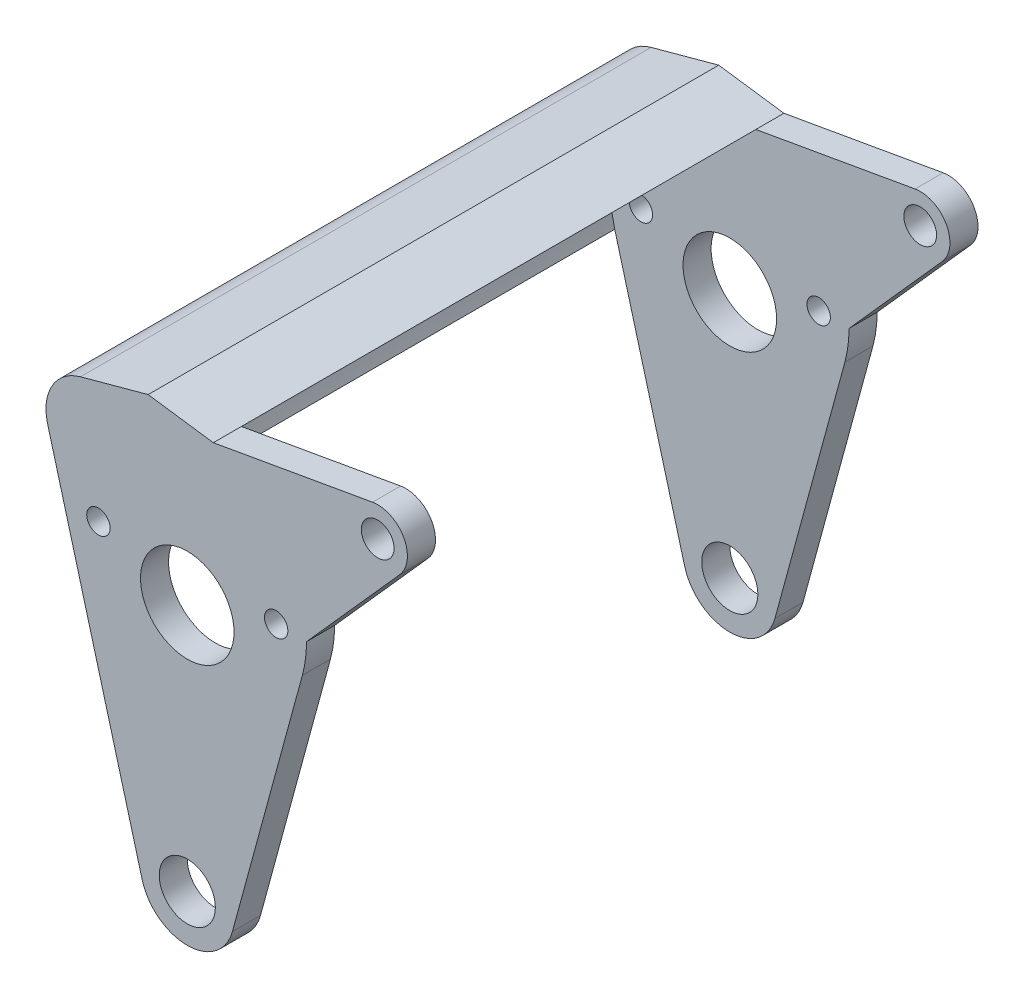
ISO-10303-21;
HEADER;
FILE_DESCRIPTION(('STEP AP214'),'2;1');
FILE_NAME('part.step','',(''),(''),'','','');
FILE_SCHEMA(('AUTOMOTIVE_DESIGN { 1 0 10303 214 1 1 1 1 }'));
ENDSEC;
DATA;
#1=APPLICATION_CONTEXT('core data for automotive mechanical design processes');
#2=APPLICATION_PROTOCOL_DEFINITION('international standard','automotive_design',2000,#1);
#3=PRODUCT_CONTEXT('',#1,'mechanical');
#4=PRODUCT('Part','Part','',(#3));
#5=PRODUCT_RELATED_PRODUCT_CATEGORY('part','',(#4));
#6=PRODUCT_DEFINITION_FORMATION('','',#4);
#7=PRODUCT_DEFINITION_CONTEXT('part definition',#1,'design');
#8=PRODUCT_DEFINITION('design','',#6,#7);
#9=PRODUCT_DEFINITION_SHAPE('','',#8);
#10=(LENGTH_UNIT() NAMED_UNIT(*) SI_UNIT(.MILLI.,.METRE.));
#11=(NAMED_UNIT(*) PLANE_ANGLE_UNIT() SI_UNIT($,.RADIAN.));
#12=(NAMED_UNIT(*) SI_UNIT($,.STERADIAN.) SOLID_ANGLE_UNIT());
#13=UNCERTAINTY_MEASURE_WITH_UNIT(LENGTH_MEASURE(1.E-05),#10,'distance_accuracy_value','');
#14=(GEOMETRIC_REPRESENTATION_CONTEXT(3) GLOBAL_UNCERTAINTY_ASSIGNED_CONTEXT((#13)) GLOBAL_UNIT_ASSIGNED_CONTEXT((#10,
#11,#12)) REPRESENTATION_CONTEXT('',''));
#15=CARTESIAN_POINT('',(0.,0.,0.));
#16=DIRECTION('',(0.,0.,1.));
#17=DIRECTION('',(1.,0.,0.));
#18=AXIS2_PLACEMENT_3D('',#15,#16,#17);
#19=CARTESIAN_POINT('',(-2.21401426525337,12.5562988509057,3.));
#20=DIRECTION('',(0.173648177666931,-0.984807753012208,0.));
#21=DIRECTION('',(0.984807753012208,0.173648177666931,0.));
#22=AXIS2_PLACEMENT_3D('',#19,#20,#21);
#23=PLANE('',#22);
#24=DIRECTION('',(0.,0.,-1.));
#25=VECTOR('',#24,1.);
#26=CARTESIAN_POINT('',(2.78598573474663,13.437933754448,3.));
#27=LINE('',#26,#25);
#28=CARTESIAN_POINT('',(2.78598573474664,13.437933754448,3.));
#29=VERTEX_POINT('',#28);
#30=CARTESIAN_POINT('',(2.78598573474664,13.437933754448,0.));
#31=VERTEX_POINT('',#30);
#32=EDGE_CURVE('E11',#29,#31,#27,.T.);
#33=ORIENTED_EDGE('',*,*,#32,.F.);
#34=DIRECTION('',(-0.984807753012208,-0.173648177666931,0.));
#35=VECTOR('',#34,1.);
#36=CARTESIAN_POINT('',(-2.21401426525337,12.5562988509057,3.));
#37=LINE('',#36,#35);
#38=CARTESIAN_POINT('',(19.8067007421462,16.439145041202,3.));
#39=VERTEX_POINT('',#38);
#40=EDGE_CURVE('E311',#39,#29,#37,.T.);
#41=ORIENTED_EDGE('',*,*,#40,.F.);
#42=DIRECTION('',(0.,0.,-1.));
#43=VECTOR('',#42,1.);
#44=CARTESIAN_POINT('',(19.8067007421462,16.439145041202,3.));
#45=LINE('',#44,#43);
#46=CARTESIAN_POINT('',(19.8067007421462,16.439145041202,0.));
#47=VERTEX_POINT('',#46);
#48=EDGE_CURVE('E313',#39,#47,#45,.T.);
#49=ORIENTED_EDGE('',*,*,#48,.T.);
#50=DIRECTION('',(-0.984807753012208,-0.173648177666931,0.));
#51=VECTOR('',#50,1.);
#52=CARTESIAN_POINT('',(-2.21401426525337,12.5562988509057,0.));
#53=LINE('',#52,#51);
#54=EDGE_CURVE('E55',#47,#31,#53,.T.);
#55=ORIENTED_EDGE('',*,*,#54,.T.);
#56=EDGE_LOOP('',(#33,#41,#49,#55));
#57=FACE_BOUND('',#56,.T.);
#58=ADVANCED_FACE('F37',(#57),#23,.F.);
#59=CARTESIAN_POINT('',(0.,0.,3.));
#60=DIRECTION('',(0.,0.,-1.));
#61=DIRECTION('',(-1.,0.,0.));
#62=AXIS2_PLACEMENT_3D('',#59,#60,#61);
#63=CYLINDRICAL_SURFACE('',#62,12.75);
#64=DIRECTION('',(0.,0.,-1.));
#65=VECTOR('',#64,1.);
#66=CARTESIAN_POINT('',(12.75,0.,3.));
#67=LINE('',#66,#65);
#68=CARTESIAN_POINT('',(12.75,0.,3.));
#69=VERTEX_POINT('',#68);
#70=CARTESIAN_POINT('',(12.75,0.,0.));
#71=VERTEX_POINT('',#70);
#72=EDGE_CURVE('E322',#69,#71,#67,.T.);
#73=ORIENTED_EDGE('',*,*,#72,.F.);
#74=CARTESIAN_POINT('',(0.,0.,3.));
#75=DIRECTION('',(0.,0.,1.));
#76=DIRECTION('',(1.,0.,0.));
#77=AXIS2_PLACEMENT_3D('',#74,#75,#76);
#78=CIRCLE('',#77,12.75);
#79=CARTESIAN_POINT('',(12.3021477313315,-3.34957627118644,3.));
#80=VERTEX_POINT('',#79);
#81=EDGE_CURVE('E357',#80,#69,#78,.T.);
#82=ORIENTED_EDGE('',*,*,#81,.F.);
#83=DIRECTION('',(0.,0.,-1.));
#84=VECTOR('',#83,1.);
#85=CARTESIAN_POINT('',(12.3021477313315,-3.34957627118644,3.));
#86=LINE('',#85,#84);
#87=CARTESIAN_POINT('',(12.3021477313315,-3.34957627118644,0.));
#88=VERTEX_POINT('',#87);
#89=EDGE_CURVE('E373',#80,#88,#86,.T.);
#90=ORIENTED_EDGE('',*,*,#89,.T.);
#91=CARTESIAN_POINT('',(0.,0.,0.));
#92=DIRECTION('',(0.,0.,1.));
#93=DIRECTION('',(1.,0.,0.));
#94=AXIS2_PLACEMENT_3D('',#91,#92,#93);
#95=CIRCLE('',#94,12.75);
#96=EDGE_CURVE('E367',#88,#71,#95,.T.);
#97=ORIENTED_EDGE('',*,*,#96,.T.);
#98=EDGE_LOOP('',(#73,#82,#90,#97));
#99=FACE_BOUND('',#98,.T.);
#100=ADVANCED_FACE('F392',(#99),#63,.T.);
#101=CARTESIAN_POINT('',(0.,-29.5,3.));
#102=DIRECTION('',(0.,0.,1.));
#103=DIRECTION('',(1.,0.,0.));
#104=AXIS2_PLACEMENT_3D('',#101,#102,#103);
#105=PLANE('',#104);
#106=CARTESIAN_POINT('',(-9.5,0.,3.));
#107=DIRECTION('',(0.,0.,1.));
#108=DIRECTION('',(1.,0.,0.));
#109=AXIS2_PLACEMENT_3D('',#106,#107,#108);
#110=CIRCLE('',#109,1.25);
#111=CARTESIAN_POINT('',(-8.25,0.,3.));
#112=VERTEX_POINT('',#111);
#113=EDGE_CURVE('E332',#112,#112,#110,.T.);
#114=ORIENTED_EDGE('',*,*,#113,.F.);
#115=EDGE_LOOP('',(#114));
#116=FACE_BOUND('',#115,.T.);
#117=CARTESIAN_POINT('',(0.,-29.5,3.));
#118=DIRECTION('',(0.,0.,1.));
#119=DIRECTION('',(1.,0.,0.));
#120=AXIS2_PLACEMENT_3D('',#117,#118,#119);
#121=CIRCLE('',#120,3.);
#122=CARTESIAN_POINT('',(3.,-29.5,3.));
#123=VERTEX_POINT('',#122);
#124=EDGE_CURVE('E344',#123,#123,#121,.T.);
#125=ORIENTED_EDGE('',*,*,#124,.F.);
#126=EDGE_LOOP('',(#125));
#127=FACE_BOUND('',#126,.T.);
#128=CARTESIAN_POINT('',(0.,-29.5,3.));
#129=DIRECTION('',(0.,0.,1.));
#130=DIRECTION('',(1.,0.,0.));
#131=AXIS2_PLACEMENT_3D('',#128,#129,#130);
#132=CIRCLE('',#131,5.);
#133=CARTESIAN_POINT('',(-4.82437165934568,-30.8135593220339,3.));
#134=VERTEX_POINT('',#133);
#135=CARTESIAN_POINT('',(4.82437165934569,-30.8135593220339,3.));
#136=VERTEX_POINT('',#135);
#137=EDGE_CURVE('E350',#134,#136,#132,.T.);
#138=ORIENTED_EDGE('',*,*,#137,.T.);
#139=DIRECTION('',(0.26271186440678,0.964874331869137,0.));
#140=VECTOR('',#139,1.);
#141=CARTESIAN_POINT('',(4.82437165934569,-30.8135593220339,3.));
#142=LINE('',#141,#140);
#143=EDGE_CURVE('E353',#136,#80,#142,.T.);
#144=ORIENTED_EDGE('',*,*,#143,.T.);
#145=ORIENTED_EDGE('',*,*,#81,.T.);
#146=DIRECTION('',(0.665275286468369,0.746598147074066,0.));
#147=VECTOR('',#146,1.);
#148=CARTESIAN_POINT('',(22.7291292970255,11.198972206111,3.));
#149=LINE('',#148,#147);
#150=CARTESIAN_POINT('',(22.7291292970255,11.198972206111,3.));
#151=VERTEX_POINT('',#150);
#152=EDGE_CURVE('E306',#69,#151,#149,.T.);
#153=ORIENTED_EDGE('',*,*,#152,.T.);
#154=CARTESIAN_POINT('',(20.3581556942314,13.3116885971033,3.));
#155=DIRECTION('',(0.,0.,1.));
#156=DIRECTION('',(-1.,0.,0.));
#157=AXIS2_PLACEMENT_3D('',#154,#155,#156);
#158=CIRCLE('',#157,3.17570250085144);
#159=EDGE_CURVE('E308',#151,#39,#158,.T.);
#160=ORIENTED_EDGE('',*,*,#159,.T.);
#161=ORIENTED_EDGE('',*,*,#40,.T.);
#162=CARTESIAN_POINT('',(-2.21401426525337,12.5562988509057,3.));
#163=VERTEX_POINT('',#162);
#164=EDGE_CURVE('E310',#29,#163,#37,.T.);
#165=ORIENTED_EDGE('',*,*,#164,.T.);
#166=CARTESIAN_POINT('',(-12.3021477313315,-3.34957627118644,3.));
#167=VERTEX_POINT('',#166);
#168=EDGE_CURVE('E356',#163,#167,#78,.T.);
#169=ORIENTED_EDGE('',*,*,#168,.T.);
#170=DIRECTION('',(0.26271186440678,-0.964874331869137,0.));
#171=VECTOR('',#170,1.);
#172=CARTESIAN_POINT('',(-4.82437165934568,-30.8135593220339,3.));
#173=LINE('',#172,#171);
#174=EDGE_CURVE('E360',#167,#134,#173,.T.);
#175=ORIENTED_EDGE('',*,*,#174,.T.);
#176=EDGE_LOOP('',(#138,#144,#145,#153,#160,#161,#165,#169,#175));
#177=FACE_BOUND('',#176,.T.);
#178=CARTESIAN_POINT('',(0.,-3.,3.));
#179=DIRECTION('',(0.,0.,1.));
#180=DIRECTION('',(1.,0.,0.));
#181=AXIS2_PLACEMENT_3D('',#178,#179,#180);
#182=CIRCLE('',#181,5.);
#183=CARTESIAN_POINT('',(5.,-3.,3.));
#184=VERTEX_POINT('',#183);
#185=EDGE_CURVE('E338',#184,#184,#182,.T.);
#186=ORIENTED_EDGE('',*,*,#185,.F.);
#187=EDGE_LOOP('',(#186));
#188=FACE_BOUND('',#187,.T.);
#189=CARTESIAN_POINT('',(9.5,0.,3.));
#190=DIRECTION('',(0.,0.,1.));
#191=DIRECTION('',(1.,0.,0.));
#192=AXIS2_PLACEMENT_3D('',#189,#190,#191);
#193=CIRCLE('',#192,1.25);
#194=CARTESIAN_POINT('',(10.75,0.,3.));
#195=VERTEX_POINT('',#194);
#196=EDGE_CURVE('E326',#195,#195,#193,.T.);
#197=ORIENTED_EDGE('',*,*,#196,.F.);
#198=EDGE_LOOP('',(#197));
#199=FACE_BOUND('',#198,.T.);
#200=CARTESIAN_POINT('',(20.3581556942314,13.3116885971033,3.));
#201=DIRECTION('',(0.,0.,1.));
#202=DIRECTION('',(1.,0.,0.));
#203=AXIS2_PLACEMENT_3D('',#200,#201,#202);
#204=CIRCLE('',#203,1.75);
#205=CARTESIAN_POINT('',(22.1081556942314,13.3116885971033,3.));
#206=VERTEX_POINT('',#205);
#207=EDGE_CURVE('E300',#206,#206,#204,.T.);
#208=ORIENTED_EDGE('',*,*,#207,.F.);
#209=EDGE_LOOP('',(#208));
#210=FACE_BOUND('',#209,.T.);
#211=ADVANCED_FACE('F395',(#116,#127,#177,#188,#199,#210),#105,.T.);
#212=CARTESIAN_POINT('',(0.,-29.5,0.));
#213=DIRECTION('',(0.,0.,1.));
#214=DIRECTION('',(1.,0.,0.));
#215=AXIS2_PLACEMENT_3D('',#212,#213,#214);
#216=PLANE('',#215);
#217=DIRECTION('',(0.26271186440678,-0.964874331869137,0.));
#218=VECTOR('',#217,1.);
#219=CARTESIAN_POINT('',(-4.82437165934568,-30.8135593220339,0.));
#220=LINE('',#219,#218);
#221=CARTESIAN_POINT('',(-14.9292663753993,6.29916704750493,0.));
#222=VERTEX_POINT('',#221);
#223=CARTESIAN_POINT('',(-4.82437165934568,-30.8135593220339,0.));
#224=VERTEX_POINT('',#223);
#225=EDGE_CURVE('E354',#222,#224,#220,.T.);
#226=ORIENTED_EDGE('',*,*,#225,.F.);
#227=CARTESIAN_POINT('',(-10.1048947160536,7.61272636953883,0.));
#228=DIRECTION('',(0.,0.,1.));
#229=DIRECTION('',(-1.,0.,0.));
#230=AXIS2_PLACEMENT_3D('',#227,#228,#229);
#231=CIRCLE('',#230,5.);
#232=CARTESIAN_POINT('',(-11.4184540380875,12.4370980288845,0.));
#233=VERTEX_POINT('',#232);
#234=EDGE_CURVE('E284',#233,#222,#231,.T.);
#235=ORIENTED_EDGE('',*,*,#234,.F.);
#236=DIRECTION('',(-0.964874331869137,-0.262711864406781,0.));
#237=VECTOR('',#236,1.);
#238=CARTESIAN_POINT('',(-11.4184540380875,12.4370980288845,0.));
#239=LINE('',#238,#237);
#240=CARTESIAN_POINT('',(-4.18189654906899,14.4074370119354,0.));
#241=VERTEX_POINT('',#240);
#242=EDGE_CURVE('E282',#241,#233,#239,.T.);
#243=ORIENTED_EDGE('',*,*,#242,.F.);
#244=DIRECTION('',(-0.990458506060585,0.137811275925573,0.));
#245=VECTOR('',#244,1.);
#246=CARTESIAN_POINT('',(-4.18189654906899,14.4074370119354,0.));
#247=LINE('',#246,#245);
#248=EDGE_CURVE('E173',#31,#241,#247,.T.);
#249=ORIENTED_EDGE('',*,*,#248,.F.);
#250=ORIENTED_EDGE('',*,*,#54,.F.);
#251=CARTESIAN_POINT('',(20.3581556942314,13.3116885971033,0.));
#252=DIRECTION('',(0.,0.,1.));
#253=DIRECTION('',(-1.,0.,0.));
#254=AXIS2_PLACEMENT_3D('',#251,#252,#253);
#255=CIRCLE('',#254,3.17570250085144);
#256=CARTESIAN_POINT('',(22.7291292970255,11.198972206111,0.));
#257=VERTEX_POINT('',#256);
#258=EDGE_CURVE('E315',#257,#47,#255,.T.);
#259=ORIENTED_EDGE('',*,*,#258,.F.);
#260=DIRECTION('',(0.665275286468369,0.746598147074066,0.));
#261=VECTOR('',#260,1.);
#262=CARTESIAN_POINT('',(22.7291292970255,11.198972206111,0.));
#263=LINE('',#262,#261);
#264=EDGE_CURVE('E303',#71,#257,#263,.T.);
#265=ORIENTED_EDGE('',*,*,#264,.F.);
#266=ORIENTED_EDGE('',*,*,#96,.F.);
#267=DIRECTION('',(0.26271186440678,0.964874331869137,0.));
#268=VECTOR('',#267,1.);
#269=CARTESIAN_POINT('',(4.82437165934569,-30.8135593220339,0.));
#270=LINE('',#269,#268);
#271=CARTESIAN_POINT('',(4.82437165934569,-30.8135593220339,0.));
#272=VERTEX_POINT('',#271);
#273=EDGE_CURVE('E365',#272,#88,#270,.T.);
#274=ORIENTED_EDGE('',*,*,#273,.F.);
#275=CARTESIAN_POINT('',(0.,-29.5,0.));
#276=DIRECTION('',(0.,0.,1.));
#277=DIRECTION('',(1.,0.,0.));
#278=AXIS2_PLACEMENT_3D('',#275,#276,#277);
#279=CIRCLE('',#278,5.);
#280=EDGE_CURVE('E347',#224,#272,#279,.T.);
#281=ORIENTED_EDGE('',*,*,#280,.F.);
#282=EDGE_LOOP('',(#226,#235,#243,#249,#250,#259,#265,#266,#274,#281));
#283=FACE_BOUND('',#282,.T.);
#284=CARTESIAN_POINT('',(0.,-29.5,0.));
#285=DIRECTION('',(0.,0.,1.));
#286=DIRECTION('',(1.,0.,0.));
#287=AXIS2_PLACEMENT_3D('',#284,#285,#286);
#288=CIRCLE('',#287,3.);
#289=CARTESIAN_POINT('',(3.,-29.5,0.));
#290=VERTEX_POINT('',#289);
#291=EDGE_CURVE('E341',#290,#290,#288,.T.);
#292=ORIENTED_EDGE('',*,*,#291,.T.);
#293=EDGE_LOOP('',(#292));
#294=FACE_BOUND('',#293,.T.);
#295=CARTESIAN_POINT('',(0.,-3.,0.));
#296=DIRECTION('',(0.,0.,1.));
#297=DIRECTION('',(1.,0.,0.));
#298=AXIS2_PLACEMENT_3D('',#295,#296,#297);
#299=CIRCLE('',#298,5.);
#300=CARTESIAN_POINT('',(5.,-3.,0.));
#301=VERTEX_POINT('',#300);
#302=EDGE_CURVE('E335',#301,#301,#299,.T.);
#303=ORIENTED_EDGE('',*,*,#302,.T.);
#304=EDGE_LOOP('',(#303));
#305=FACE_BOUND('',#304,.T.);
#306=CARTESIAN_POINT('',(-9.5,0.,0.));
#307=DIRECTION('',(0.,0.,1.));
#308=DIRECTION('',(1.,0.,0.));
#309=AXIS2_PLACEMENT_3D('',#306,#307,#308);
#310=CIRCLE('',#309,1.25);
#311=CARTESIAN_POINT('',(-8.25,0.,0.));
#312=VERTEX_POINT('',#311);
#313=EDGE_CURVE('E329',#312,#312,#310,.T.);
#314=ORIENTED_EDGE('',*,*,#313,.T.);
#315=EDGE_LOOP('',(#314));
#316=FACE_BOUND('',#315,.T.);
#317=CARTESIAN_POINT('',(9.5,0.,0.));
#318=DIRECTION('',(0.,0.,1.));
#319=DIRECTION('',(1.,0.,0.));
#320=AXIS2_PLACEMENT_3D('',#317,#318,#319);
#321=CIRCLE('',#320,1.25);
#322=CARTESIAN_POINT('',(10.75,0.,0.));
#323=VERTEX_POINT('',#322);
#324=EDGE_CURVE('E325',#323,#323,#321,.T.);
#325=ORIENTED_EDGE('',*,*,#324,.T.);
#326=EDGE_LOOP('',(#325));
#327=FACE_BOUND('',#326,.T.);
#328=CARTESIAN_POINT('',(20.3581556942314,13.3116885971033,0.));
#329=DIRECTION('',(0.,0.,1.));
#330=DIRECTION('',(1.,0.,0.));
#331=AXIS2_PLACEMENT_3D('',#328,#329,#330);
#332=CIRCLE('',#331,1.75);
#333=CARTESIAN_POINT('',(22.1081556942314,13.3116885971033,0.));
#334=VERTEX_POINT('',#333);
#335=EDGE_CURVE('E299',#334,#334,#332,.T.);
#336=ORIENTED_EDGE('',*,*,#335,.T.);
#337=EDGE_LOOP('',(#336));
#338=FACE_BOUND('',#337,.T.);
#339=ADVANCED_FACE('F385',(#283,#294,#305,#316,#327,#338),#216,.F.);
#340=CARTESIAN_POINT('',(0.,-29.5,3.));
#341=DIRECTION('',(0.,0.,-1.));
#342=DIRECTION('',(-1.,0.,0.));
#343=AXIS2_PLACEMENT_3D('',#340,#341,#342);
#344=CYLINDRICAL_SURFACE('',#343,5.);
#345=ORIENTED_EDGE('',*,*,#280,.T.);
#346=DIRECTION('',(0.,0.,-1.));
#347=VECTOR('',#346,1.);
#348=CARTESIAN_POINT('',(4.82437165934569,-30.8135593220339,3.));
#349=LINE('',#348,#347);
#350=EDGE_CURVE('E45',#136,#272,#349,.T.);
#351=ORIENTED_EDGE('',*,*,#350,.F.);
#352=ORIENTED_EDGE('',*,*,#137,.F.);
#353=DIRECTION('',(0.,0.,-1.));
#354=VECTOR('',#353,1.);
#355=CARTESIAN_POINT('',(-4.82437165934568,-30.8135593220339,3.));
#356=LINE('',#355,#354);
#357=EDGE_CURVE('E362',#134,#224,#356,.T.);
#358=ORIENTED_EDGE('',*,*,#357,.T.);
#359=EDGE_LOOP('',(#345,#351,#352,#358));
#360=FACE_BOUND('',#359,.T.);
#361=ADVANCED_FACE('F39',(#360),#344,.T.);
#362=CARTESIAN_POINT('',(4.82437165934569,-30.8135593220339,3.));
#363=DIRECTION('',(-0.964874331869137,0.26271186440678,0.));
#364=DIRECTION('',(-0.26271186440678,-0.964874331869137,0.));
#365=AXIS2_PLACEMENT_3D('',#362,#363,#364);
#366=PLANE('',#365);
#367=ORIENTED_EDGE('',*,*,#273,.T.);
#368=ORIENTED_EDGE('',*,*,#89,.F.);
#369=ORIENTED_EDGE('',*,*,#143,.F.);
#370=ORIENTED_EDGE('',*,*,#350,.T.);
#371=EDGE_LOOP('',(#367,#368,#369,#370));
#372=FACE_BOUND('',#371,.T.);
#373=ADVANCED_FACE('F378',(#372),#366,.F.);
#374=CARTESIAN_POINT('',(-4.82437165934568,-30.8135593220339,3.));
#375=DIRECTION('',(0.964874331869137,0.26271186440678,0.));
#376=DIRECTION('',(-0.26271186440678,0.964874331869137,0.));
#377=AXIS2_PLACEMENT_3D('',#374,#375,#376);
#378=PLANE('',#377);
#379=ORIENTED_EDGE('',*,*,#225,.T.);
#380=ORIENTED_EDGE('',*,*,#357,.F.);
#381=ORIENTED_EDGE('',*,*,#174,.F.);
#382=DIRECTION('',(0.,0.,-1.));
#383=VECTOR('',#382,1.);
#384=CARTESIAN_POINT('',(-12.3021477313315,-3.34957627118644,30.5));
#385=LINE('',#384,#383);
#386=CARTESIAN_POINT('',(-12.3021477313315,-3.34957627118644,58.));
#387=VERTEX_POINT('',#386);
#388=EDGE_CURVE('E287',#387,#167,#385,.T.);
#389=ORIENTED_EDGE('',*,*,#388,.F.);
#390=DIRECTION('',(0.26271186440678,-0.964874331869137,0.));
#391=VECTOR('',#390,1.);
#392=CARTESIAN_POINT('',(-4.82437165934568,-30.8135593220339,58.));
#393=LINE('',#392,#391);
#394=CARTESIAN_POINT('',(-4.82437165934568,-30.8135593220339,58.));
#395=VERTEX_POINT('',#394);
#396=EDGE_CURVE('E261',#387,#395,#393,.T.);
#397=ORIENTED_EDGE('',*,*,#396,.T.);
#398=DIRECTION('',(0.,0.,1.));
#399=VECTOR('',#398,1.);
#400=CARTESIAN_POINT('',(-4.82437165934568,-30.8135593220339,58.));
#401=LINE('',#400,#399);
#402=CARTESIAN_POINT('',(-4.82437165934568,-30.8135593220339,61.));
#403=VERTEX_POINT('',#402);
#404=EDGE_CURVE('E264',#395,#403,#401,.T.);
#405=ORIENTED_EDGE('',*,*,#404,.T.);
#406=DIRECTION('',(0.26271186440678,-0.964874331869137,0.));
#407=VECTOR('',#406,1.);
#408=CARTESIAN_POINT('',(-4.82437165934568,-30.8135593220339,61.));
#409=LINE('',#408,#407);
#410=CARTESIAN_POINT('',(-14.9292663753993,6.29916704750493,61.));
#411=VERTEX_POINT('',#410);
#412=EDGE_CURVE('E255',#411,#403,#409,.T.);
#413=ORIENTED_EDGE('',*,*,#412,.F.);
#414=DIRECTION('',(0.,0.,-1.));
#415=VECTOR('',#414,1.);
#416=CARTESIAN_POINT('',(-14.9292663753993,6.29916704750493,30.5));
#417=LINE('',#416,#415);
#418=EDGE_CURVE('E290',#411,#222,#417,.T.);
#419=ORIENTED_EDGE('',*,*,#418,.T.);
#420=EDGE_LOOP('',(#379,#380,#381,#389,#397,#405,#413,#419));
#421=FACE_BOUND('',#420,.T.);
#422=ADVANCED_FACE('F401',(#421),#378,.F.);
#423=CARTESIAN_POINT('',(0.,-29.5,3.));
#424=DIRECTION('',(0.,0.,-1.));
#425=DIRECTION('',(-1.,0.,0.));
#426=AXIS2_PLACEMENT_3D('',#423,#424,#425);
#427=CYLINDRICAL_SURFACE('',#426,3.);
#428=ORIENTED_EDGE('',*,*,#124,.T.);
#429=EDGE_LOOP('',(#428));
#430=FACE_BOUND('',#429,.T.);
#431=ORIENTED_EDGE('',*,*,#291,.F.);
#432=EDGE_LOOP('',(#431));
#433=FACE_BOUND('',#432,.T.);
#434=ADVANCED_FACE('F478',(#430,#433),#427,.F.);
#435=CARTESIAN_POINT('',(0.,-3.,3.));
#436=DIRECTION('',(0.,0.,-1.));
#437=DIRECTION('',(-1.,0.,0.));
#438=AXIS2_PLACEMENT_3D('',#435,#436,#437);
#439=CYLINDRICAL_SURFACE('',#438,5.);
#440=ORIENTED_EDGE('',*,*,#185,.T.);
#441=EDGE_LOOP('',(#440));
#442=FACE_BOUND('',#441,.T.);
#443=ORIENTED_EDGE('',*,*,#302,.F.);
#444=EDGE_LOOP('',(#443));
#445=FACE_BOUND('',#444,.T.);
#446=ADVANCED_FACE('F474',(#442,#445),#439,.F.);
#447=CARTESIAN_POINT('',(-9.5,0.,3.));
#448=DIRECTION('',(0.,0.,-1.));
#449=DIRECTION('',(-1.,0.,0.));
#450=AXIS2_PLACEMENT_3D('',#447,#448,#449);
#451=CYLINDRICAL_SURFACE('',#450,1.25);
#452=ORIENTED_EDGE('',*,*,#113,.T.);
#453=EDGE_LOOP('',(#452));
#454=FACE_BOUND('',#453,.T.);
#455=ORIENTED_EDGE('',*,*,#313,.F.);
#456=EDGE_LOOP('',(#455));
#457=FACE_BOUND('',#456,.T.);
#458=ADVANCED_FACE('F470',(#454,#457),#451,.F.);
#459=CARTESIAN_POINT('',(9.5,0.,3.));
#460=DIRECTION('',(0.,0.,-1.));
#461=DIRECTION('',(-1.,0.,0.));
#462=AXIS2_PLACEMENT_3D('',#459,#460,#461);
#463=CYLINDRICAL_SURFACE('',#462,1.25);
#464=ORIENTED_EDGE('',*,*,#196,.T.);
#465=EDGE_LOOP('',(#464));
#466=FACE_BOUND('',#465,.T.);
#467=ORIENTED_EDGE('',*,*,#324,.F.);
#468=EDGE_LOOP('',(#467));
#469=FACE_BOUND('',#468,.T.);
#470=ADVANCED_FACE('F466',(#466,#469),#463,.F.);
#471=CARTESIAN_POINT('',(22.7291292970255,11.198972206111,3.));
#472=DIRECTION('',(-0.746598147074066,0.665275286468369,0.));
#473=DIRECTION('',(-0.665275286468369,-0.746598147074066,0.));
#474=AXIS2_PLACEMENT_3D('',#471,#472,#473);
#475=PLANE('',#474);
#476=ORIENTED_EDGE('',*,*,#264,.T.);
#477=DIRECTION('',(0.,0.,-1.));
#478=VECTOR('',#477,1.);
#479=CARTESIAN_POINT('',(22.7291292970255,11.198972206111,3.));
#480=LINE('',#479,#478);
#481=EDGE_CURVE('E319',#151,#257,#480,.T.);
#482=ORIENTED_EDGE('',*,*,#481,.F.);
#483=ORIENTED_EDGE('',*,*,#152,.F.);
#484=ORIENTED_EDGE('',*,*,#72,.T.);
#485=EDGE_LOOP('',(#476,#482,#483,#484));
#486=FACE_BOUND('',#485,.T.);
#487=ADVANCED_FACE('F462',(#486),#475,.F.);
#488=CARTESIAN_POINT('',(20.3581556942314,13.3116885971033,3.));
#489=DIRECTION('',(0.,0.,-1.));
#490=DIRECTION('',(-1.,0.,0.));
#491=AXIS2_PLACEMENT_3D('',#488,#489,#490);
#492=CYLINDRICAL_SURFACE('',#491,3.17570250085144);
#493=ORIENTED_EDGE('',*,*,#258,.T.);
#494=ORIENTED_EDGE('',*,*,#48,.F.);
#495=ORIENTED_EDGE('',*,*,#159,.F.);
#496=ORIENTED_EDGE('',*,*,#481,.T.);
#497=EDGE_LOOP('',(#493,#494,#495,#496));
#498=FACE_BOUND('',#497,.T.);
#499=ADVANCED_FACE('F450',(#498),#492,.T.);
#500=CARTESIAN_POINT('',(20.3581556942314,13.3116885971033,3.));
#501=DIRECTION('',(0.,0.,-1.));
#502=DIRECTION('',(-1.,0.,0.));
#503=AXIS2_PLACEMENT_3D('',#500,#501,#502);
#504=CYLINDRICAL_SURFACE('',#503,1.75);
#505=ORIENTED_EDGE('',*,*,#207,.T.);
#506=EDGE_LOOP('',(#505));
#507=FACE_BOUND('',#506,.T.);
#508=ORIENTED_EDGE('',*,*,#335,.F.);
#509=EDGE_LOOP('',(#508));
#510=FACE_BOUND('',#509,.T.);
#511=ADVANCED_FACE('F443',(#507,#510),#504,.F.);
#512=CARTESIAN_POINT('',(0.,0.,30.5));
#513=DIRECTION('',(0.,0.,-1.));
#514=DIRECTION('',(-1.,0.,0.));
#515=AXIS2_PLACEMENT_3D('',#512,#513,#514);
#516=CYLINDRICAL_SURFACE('',#515,12.75);
#517=ORIENTED_EDGE('',*,*,#168,.F.);
#518=DIRECTION('',(0.,0.,-1.));
#519=VECTOR('',#518,1.);
#520=CARTESIAN_POINT('',(-2.21401426525337,12.5562988509057,30.5));
#521=LINE('',#520,#519);
#522=CARTESIAN_POINT('',(-2.21401426525337,12.5562988509057,58.));
#523=VERTEX_POINT('',#522);
#524=EDGE_CURVE('E296',#523,#163,#521,.T.);
#525=ORIENTED_EDGE('',*,*,#524,.F.);
#526=CARTESIAN_POINT('',(0.,0.,58.));
#527=DIRECTION('',(0.,0.,1.));
#528=DIRECTION('',(1.,0.,0.));
#529=AXIS2_PLACEMENT_3D('',#526,#527,#528);
#530=CIRCLE('',#529,12.75);
#531=EDGE_CURVE('E257',#523,#387,#530,.T.);
#532=ORIENTED_EDGE('',*,*,#531,.T.);
#533=ORIENTED_EDGE('',*,*,#388,.T.);
#534=EDGE_LOOP('',(#517,#525,#532,#533));
#535=FACE_BOUND('',#534,.T.);
#536=ADVANCED_FACE('F441',(#535),#516,.F.);
#537=CARTESIAN_POINT('',(2.78598573474663,13.437933754448,30.5));
#538=DIRECTION('',(-0.173648177666931,0.984807753012208,0.));
#539=DIRECTION('',(-0.984807753012208,-0.173648177666931,0.));
#540=AXIS2_PLACEMENT_3D('',#537,#538,#539);
#541=PLANE('',#540);
#542=ORIENTED_EDGE('',*,*,#164,.F.);
#543=DIRECTION('',(0.,0.,-1.));
#544=VECTOR('',#543,1.);
#545=CARTESIAN_POINT('',(2.78598573474663,13.437933754448,30.5));
#546=LINE('',#545,#544);
#547=CARTESIAN_POINT('',(2.78598573474664,13.437933754448,58.));
#548=VERTEX_POINT('',#547);
#549=EDGE_CURVE('E176',#548,#29,#546,.T.);
#550=ORIENTED_EDGE('',*,*,#549,.F.);
#551=DIRECTION('',(-0.984807753012208,-0.173648177666931,0.));
#552=VECTOR('',#551,1.);
#553=CARTESIAN_POINT('',(-2.21401426525337,12.5562988509057,58.));
#554=LINE('',#553,#552);
#555=EDGE_CURVE('E209',#548,#523,#554,.T.);
#556=ORIENTED_EDGE('',*,*,#555,.T.);
#557=ORIENTED_EDGE('',*,*,#524,.T.);
#558=EDGE_LOOP('',(#542,#550,#556,#557));
#559=FACE_BOUND('',#558,.T.);
#560=ADVANCED_FACE('F433',(#559),#541,.F.);
#561=CARTESIAN_POINT('',(-4.18189654906899,14.4074370119354,30.5));
#562=DIRECTION('',(-0.137811275925573,-0.990458506060585,0.));
#563=DIRECTION('',(0.990458506060585,-0.137811275925573,0.));
#564=AXIS2_PLACEMENT_3D('',#561,#562,#563);
#565=PLANE('',#564);
#566=ORIENTED_EDGE('',*,*,#248,.T.);
#567=DIRECTION('',(0.,0.,-1.));
#568=VECTOR('',#567,1.);
#569=CARTESIAN_POINT('',(-4.18189654906899,14.4074370119354,30.5));
#570=LINE('',#569,#568);
#571=CARTESIAN_POINT('',(-4.18189654906899,14.4074370119354,61.));
#572=VERTEX_POINT('',#571);
#573=EDGE_CURVE('E165',#572,#241,#570,.T.);
#574=ORIENTED_EDGE('',*,*,#573,.F.);
#575=DIRECTION('',(-0.990458506060585,0.137811275925573,0.));
#576=VECTOR('',#575,1.);
#577=CARTESIAN_POINT('',(-4.18189654906899,14.4074370119354,61.));
#578=LINE('',#577,#576);
#579=CARTESIAN_POINT('',(2.78598573474664,13.437933754448,61.));
#580=VERTEX_POINT('',#579);
#581=EDGE_CURVE('E170',#580,#572,#578,.T.);
#582=ORIENTED_EDGE('',*,*,#581,.F.);
#583=DIRECTION('',(0.,0.,1.));
#584=VECTOR('',#583,1.);
#585=CARTESIAN_POINT('',(2.78598573474663,13.437933754448,58.));
#586=LINE('',#585,#584);
#587=EDGE_CURVE('E279',#548,#580,#586,.T.);
#588=ORIENTED_EDGE('',*,*,#587,.F.);
#589=ORIENTED_EDGE('',*,*,#549,.T.);
#590=ORIENTED_EDGE('',*,*,#32,.T.);
#591=EDGE_LOOP('',(#566,#574,#582,#588,#589,#590));
#592=FACE_BOUND('',#591,.T.);
#593=ADVANCED_FACE('F167',(#592),#565,.F.);
#594=CARTESIAN_POINT('',(-11.4184540380875,12.4370980288845,30.5));
#595=DIRECTION('',(0.262711864406781,-0.964874331869137,0.));
#596=DIRECTION('',(0.964874331869137,0.262711864406781,0.));
#597=AXIS2_PLACEMENT_3D('',#594,#595,#596);
#598=PLANE('',#597);
#599=ORIENTED_EDGE('',*,*,#242,.T.);
#600=DIRECTION('',(0.,0.,-1.));
#601=VECTOR('',#600,1.);
#602=CARTESIAN_POINT('',(-11.4184540380875,12.4370980288845,30.5));
#603=LINE('',#602,#601);
#604=CARTESIAN_POINT('',(-11.4184540380875,12.4370980288845,61.));
#605=VERTEX_POINT('',#604);
#606=EDGE_CURVE('E177',#605,#233,#603,.T.);
#607=ORIENTED_EDGE('',*,*,#606,.F.);
#608=DIRECTION('',(-0.964874331869137,-0.262711864406781,0.));
#609=VECTOR('',#608,1.);
#610=CARTESIAN_POINT('',(-11.4184540380875,12.4370980288845,61.));
#611=LINE('',#610,#609);
#612=EDGE_CURVE('E180',#572,#605,#611,.T.);
#613=ORIENTED_EDGE('',*,*,#612,.F.);
#614=ORIENTED_EDGE('',*,*,#573,.T.);
#615=EDGE_LOOP('',(#599,#607,#613,#614));
#616=FACE_BOUND('',#615,.T.);
#617=ADVANCED_FACE('F181',(#616),#598,.F.);
#618=CARTESIAN_POINT('',(-10.1048947160536,7.61272636953883,30.5));
#619=DIRECTION('',(0.,0.,-1.));
#620=DIRECTION('',(-1.,0.,0.));
#621=AXIS2_PLACEMENT_3D('',#618,#619,#620);
#622=CYLINDRICAL_SURFACE('',#621,5.);
#623=ORIENTED_EDGE('',*,*,#234,.T.);
#624=ORIENTED_EDGE('',*,*,#418,.F.);
#625=CARTESIAN_POINT('',(-10.1048947160536,7.61272636953883,61.));
#626=DIRECTION('',(0.,0.,1.));
#627=DIRECTION('',(-1.,0.,0.));
#628=AXIS2_PLACEMENT_3D('',#625,#626,#627);
#629=CIRCLE('',#628,5.);
#630=EDGE_CURVE('E186',#605,#411,#629,.T.);
#631=ORIENTED_EDGE('',*,*,#630,.F.);
#632=ORIENTED_EDGE('',*,*,#606,.T.);
#633=EDGE_LOOP('',(#623,#624,#631,#632));
#634=FACE_BOUND('',#633,.T.);
#635=ADVANCED_FACE('F404',(#634),#622,.T.);
#636=CARTESIAN_POINT('',(-2.21401426525337,12.5562988509057,58.));
#637=DIRECTION('',(0.173648177666931,-0.984807753012208,0.));
#638=DIRECTION('',(0.984807753012208,0.173648177666931,0.));
#639=AXIS2_PLACEMENT_3D('',#636,#637,#638);
#640=PLANE('',#639);
#641=ORIENTED_EDGE('',*,*,#587,.T.);
#642=DIRECTION('',(-0.984807753012208,-0.173648177666931,0.));
#643=VECTOR('',#642,1.);
#644=CARTESIAN_POINT('',(-2.21401426525337,12.5562988509057,61.));
#645=LINE('',#644,#643);
#646=CARTESIAN_POINT('',(19.8067007421462,16.439145041202,61.));
#647=VERTEX_POINT('',#646);
#648=EDGE_CURVE('E192',#647,#580,#645,.T.);
#649=ORIENTED_EDGE('',*,*,#648,.F.);
#650=DIRECTION('',(0.,0.,1.));
#651=VECTOR('',#650,1.);
#652=CARTESIAN_POINT('',(19.8067007421462,16.439145041202,58.));
#653=LINE('',#652,#651);
#654=CARTESIAN_POINT('',(19.8067007421462,16.439145041202,58.));
#655=VERTEX_POINT('',#654);
#656=EDGE_CURVE('E213',#655,#647,#653,.T.);
#657=ORIENTED_EDGE('',*,*,#656,.F.);
#658=EDGE_CURVE('E210',#655,#548,#554,.T.);
#659=ORIENTED_EDGE('',*,*,#658,.T.);
#660=EDGE_LOOP('',(#641,#649,#657,#659));
#661=FACE_BOUND('',#660,.T.);
#662=ADVANCED_FACE('F428',(#661),#640,.F.);
#663=CARTESIAN_POINT('',(0.,0.,58.));
#664=DIRECTION('',(0.,0.,1.));
#665=DIRECTION('',(-1.,0.,0.));
#666=AXIS2_PLACEMENT_3D('',#663,#664,#665);
#667=CYLINDRICAL_SURFACE('',#666,12.75);
#668=DIRECTION('',(0.,0.,1.));
#669=VECTOR('',#668,1.);
#670=CARTESIAN_POINT('',(12.75,0.,58.));
#671=LINE('',#670,#669);
#672=CARTESIAN_POINT('',(12.75,0.,58.));
#673=VERTEX_POINT('',#672);
#674=CARTESIAN_POINT('',(12.75,0.,61.));
#675=VERTEX_POINT('',#674);
#676=EDGE_CURVE('E223',#673,#675,#671,.T.);
#677=ORIENTED_EDGE('',*,*,#676,.T.);
#678=CARTESIAN_POINT('',(0.,0.,61.));
#679=DIRECTION('',(0.,0.,1.));
#680=DIRECTION('',(1.,0.,0.));
#681=AXIS2_PLACEMENT_3D('',#678,#679,#680);
#682=CIRCLE('',#681,12.75);
#683=CARTESIAN_POINT('',(12.3021477313315,-3.34957627118644,61.));
#684=VERTEX_POINT('',#683);
#685=EDGE_CURVE('E269',#684,#675,#682,.T.);
#686=ORIENTED_EDGE('',*,*,#685,.F.);
#687=DIRECTION('',(0.,0.,1.));
#688=VECTOR('',#687,1.);
#689=CARTESIAN_POINT('',(12.3021477313315,-3.34957627118644,58.));
#690=LINE('',#689,#688);
#691=CARTESIAN_POINT('',(12.3021477313315,-3.34957627118644,58.));
#692=VERTEX_POINT('',#691);
#693=EDGE_CURVE('E274',#692,#684,#690,.T.);
#694=ORIENTED_EDGE('',*,*,#693,.F.);
#695=EDGE_CURVE('E258',#692,#673,#530,.T.);
#696=ORIENTED_EDGE('',*,*,#695,.T.);
#697=EDGE_LOOP('',(#677,#686,#694,#696));
#698=FACE_BOUND('',#697,.T.);
#699=ADVANCED_FACE('F417',(#698),#667,.T.);
#700=CARTESIAN_POINT('',(0.,-29.5,58.));
#701=DIRECTION('',(0.,0.,-1.));
#702=DIRECTION('',(1.,0.,0.));
#703=AXIS2_PLACEMENT_3D('',#700,#701,#702);
#704=PLANE('',#703);
#705=CARTESIAN_POINT('',(-9.5,0.,58.));
#706=DIRECTION('',(0.,0.,1.));
#707=DIRECTION('',(1.,0.,0.));
#708=AXIS2_PLACEMENT_3D('',#705,#706,#707);
#709=CIRCLE('',#708,1.25);
#710=CARTESIAN_POINT('',(-8.25,0.,58.));
#711=VERTEX_POINT('',#710);
#712=EDGE_CURVE('E233',#711,#711,#709,.T.);
#713=ORIENTED_EDGE('',*,*,#712,.T.);
#714=EDGE_LOOP('',(#713));
#715=FACE_BOUND('',#714,.T.);
#716=CARTESIAN_POINT('',(0.,-29.5,58.));
#717=DIRECTION('',(0.,0.,1.));
#718=DIRECTION('',(1.,0.,0.));
#719=AXIS2_PLACEMENT_3D('',#716,#717,#718);
#720=CIRCLE('',#719,3.);
#721=CARTESIAN_POINT('',(3.,-29.5,58.));
#722=VERTEX_POINT('',#721);
#723=EDGE_CURVE('E245',#722,#722,#720,.T.);
#724=ORIENTED_EDGE('',*,*,#723,.T.);
#725=EDGE_LOOP('',(#724));
#726=FACE_BOUND('',#725,.T.);
#727=CARTESIAN_POINT('',(0.,-29.5,58.));
#728=DIRECTION('',(0.,0.,1.));
#729=DIRECTION('',(1.,0.,0.));
#730=AXIS2_PLACEMENT_3D('',#727,#728,#729);
#731=CIRCLE('',#730,5.);
#732=CARTESIAN_POINT('',(4.82437165934569,-30.8135593220339,58.));
#733=VERTEX_POINT('',#732);
#734=EDGE_CURVE('E251',#395,#733,#731,.T.);
#735=ORIENTED_EDGE('',*,*,#734,.F.);
#736=ORIENTED_EDGE('',*,*,#396,.F.);
#737=ORIENTED_EDGE('',*,*,#531,.F.);
#738=ORIENTED_EDGE('',*,*,#555,.F.);
#739=ORIENTED_EDGE('',*,*,#658,.F.);
#740=CARTESIAN_POINT('',(20.3581556942314,13.3116885971033,58.));
#741=DIRECTION('',(0.,0.,1.));
#742=DIRECTION('',(-1.,0.,0.));
#743=AXIS2_PLACEMENT_3D('',#740,#741,#742);
#744=CIRCLE('',#743,3.17570250085144);
#745=CARTESIAN_POINT('',(22.7291292970255,11.198972206111,58.));
#746=VERTEX_POINT('',#745);
#747=EDGE_CURVE('E207',#746,#655,#744,.T.);
#748=ORIENTED_EDGE('',*,*,#747,.F.);
#749=DIRECTION('',(0.665275286468369,0.746598147074066,0.));
#750=VECTOR('',#749,1.);
#751=CARTESIAN_POINT('',(22.7291292970255,11.198972206111,58.));
#752=LINE('',#751,#750);
#753=EDGE_CURVE('E204',#673,#746,#752,.T.);
#754=ORIENTED_EDGE('',*,*,#753,.F.);
#755=ORIENTED_EDGE('',*,*,#695,.F.);
#756=DIRECTION('',(0.26271186440678,0.964874331869137,0.));
#757=VECTOR('',#756,1.);
#758=CARTESIAN_POINT('',(4.82437165934569,-30.8135593220339,58.));
#759=LINE('',#758,#757);
#760=EDGE_CURVE('E254',#733,#692,#759,.T.);
#761=ORIENTED_EDGE('',*,*,#760,.F.);
#762=EDGE_LOOP('',(#735,#736,#737,#738,#739,#748,#754,#755,#761));
#763=FACE_BOUND('',#762,.T.);
#764=CARTESIAN_POINT('',(0.,-3.,58.));
#765=DIRECTION('',(0.,0.,1.));
#766=DIRECTION('',(1.,0.,0.));
#767=AXIS2_PLACEMENT_3D('',#764,#765,#766);
#768=CIRCLE('',#767,5.);
#769=CARTESIAN_POINT('',(5.,-3.,58.));
#770=VERTEX_POINT('',#769);
#771=EDGE_CURVE('E239',#770,#770,#768,.T.);
#772=ORIENTED_EDGE('',*,*,#771,.T.);
#773=EDGE_LOOP('',(#772));
#774=FACE_BOUND('',#773,.T.);
#775=CARTESIAN_POINT('',(9.5,0.,58.));
#776=DIRECTION('',(0.,0.,1.));
#777=DIRECTION('',(1.,0.,0.));
#778=AXIS2_PLACEMENT_3D('',#775,#776,#777);
#779=CIRCLE('',#778,1.25);
#780=CARTESIAN_POINT('',(10.75,0.,58.));
#781=VERTEX_POINT('',#780);
#782=EDGE_CURVE('E227',#781,#781,#779,.T.);
#783=ORIENTED_EDGE('',*,*,#782,.T.);
#784=EDGE_LOOP('',(#783));
#785=FACE_BOUND('',#784,.T.);
#786=CARTESIAN_POINT('',(20.3581556942314,13.3116885971033,58.));
#787=DIRECTION('',(0.,0.,1.));
#788=DIRECTION('',(1.,0.,0.));
#789=AXIS2_PLACEMENT_3D('',#786,#787,#788);
#790=CIRCLE('',#789,1.75);
#791=CARTESIAN_POINT('',(22.1081556942314,13.3116885971033,58.));
#792=VERTEX_POINT('',#791);
#793=EDGE_CURVE('E198',#792,#792,#790,.T.);
#794=ORIENTED_EDGE('',*,*,#793,.T.);
#795=EDGE_LOOP('',(#794));
#796=FACE_BOUND('',#795,.T.);
#797=ADVANCED_FACE('F436',(#715,#726,#763,#774,#785,#796),#704,.T.);
#798=CARTESIAN_POINT('',(0.,-29.5,61.));
#799=DIRECTION('',(0.,0.,-1.));
#800=DIRECTION('',(1.,0.,0.));
#801=AXIS2_PLACEMENT_3D('',#798,#799,#800);
#802=PLANE('',#801);
#803=ORIENTED_EDGE('',*,*,#412,.T.);
#804=CARTESIAN_POINT('',(0.,-29.5,61.));
#805=DIRECTION('',(0.,0.,1.));
#806=DIRECTION('',(1.,0.,0.));
#807=AXIS2_PLACEMENT_3D('',#804,#805,#806);
#808=CIRCLE('',#807,5.);
#809=CARTESIAN_POINT('',(4.82437165934569,-30.8135593220339,61.));
#810=VERTEX_POINT('',#809);
#811=EDGE_CURVE('E248',#403,#810,#808,.T.);
#812=ORIENTED_EDGE('',*,*,#811,.T.);
#813=DIRECTION('',(0.26271186440678,0.964874331869137,0.));
#814=VECTOR('',#813,1.);
#815=CARTESIAN_POINT('',(4.82437165934569,-30.8135593220339,61.));
#816=LINE('',#815,#814);
#817=EDGE_CURVE('E267',#810,#684,#816,.T.);
#818=ORIENTED_EDGE('',*,*,#817,.T.);
#819=ORIENTED_EDGE('',*,*,#685,.T.);
#820=DIRECTION('',(0.665275286468369,0.746598147074066,0.));
#821=VECTOR('',#820,1.);
#822=CARTESIAN_POINT('',(22.7291292970255,11.198972206111,61.));
#823=LINE('',#822,#821);
#824=CARTESIAN_POINT('',(22.7291292970255,11.198972206111,61.));
#825=VERTEX_POINT('',#824);
#826=EDGE_CURVE('E201',#675,#825,#823,.T.);
#827=ORIENTED_EDGE('',*,*,#826,.T.);
#828=CARTESIAN_POINT('',(20.3581556942314,13.3116885971033,61.));
#829=DIRECTION('',(0.,0.,1.));
#830=DIRECTION('',(-1.,0.,0.));
#831=AXIS2_PLACEMENT_3D('',#828,#829,#830);
#832=CIRCLE('',#831,3.17570250085144);
#833=EDGE_CURVE('E216',#825,#647,#832,.T.);
#834=ORIENTED_EDGE('',*,*,#833,.T.);
#835=ORIENTED_EDGE('',*,*,#648,.T.);
#836=ORIENTED_EDGE('',*,*,#581,.T.);
#837=ORIENTED_EDGE('',*,*,#612,.T.);
#838=ORIENTED_EDGE('',*,*,#630,.T.);
#839=EDGE_LOOP('',(#803,#812,#818,#819,#827,#834,#835,#836,#837,#838));
#840=FACE_BOUND('',#839,.T.);
#841=CARTESIAN_POINT('',(0.,-29.5,61.));
#842=DIRECTION('',(0.,0.,1.));
#843=DIRECTION('',(1.,0.,0.));
#844=AXIS2_PLACEMENT_3D('',#841,#842,#843);
#845=CIRCLE('',#844,3.);
#846=CARTESIAN_POINT('',(3.,-29.5,61.));
#847=VERTEX_POINT('',#846);
#848=EDGE_CURVE('E242',#847,#847,#845,.T.);
#849=ORIENTED_EDGE('',*,*,#848,.F.);
#850=EDGE_LOOP('',(#849));
#851=FACE_BOUND('',#850,.T.);
#852=CARTESIAN_POINT('',(0.,-3.,61.));
#853=DIRECTION('',(0.,0.,1.));
#854=DIRECTION('',(1.,0.,0.));
#855=AXIS2_PLACEMENT_3D('',#852,#853,#854);
#856=CIRCLE('',#855,5.);
#857=CARTESIAN_POINT('',(5.,-3.,61.));
#858=VERTEX_POINT('',#857);
#859=EDGE_CURVE('E236',#858,#858,#856,.T.);
#860=ORIENTED_EDGE('',*,*,#859,.F.);
#861=EDGE_LOOP('',(#860));
#862=FACE_BOUND('',#861,.T.);
#863=CARTESIAN_POINT('',(-9.5,0.,61.));
#864=DIRECTION('',(0.,0.,1.));
#865=DIRECTION('',(1.,0.,0.));
#866=AXIS2_PLACEMENT_3D('',#863,#864,#865);
#867=CIRCLE('',#866,1.25);
#868=CARTESIAN_POINT('',(-8.25,0.,61.));
#869=VERTEX_POINT('',#868);
#870=EDGE_CURVE('E230',#869,#869,#867,.T.);
#871=ORIENTED_EDGE('',*,*,#870,.F.);
#872=EDGE_LOOP('',(#871));
#873=FACE_BOUND('',#872,.T.);
#874=CARTESIAN_POINT('',(9.5,0.,61.));
#875=DIRECTION('',(0.,0.,1.));
#876=DIRECTION('',(1.,0.,0.));
#877=AXIS2_PLACEMENT_3D('',#874,#875,#876);
#878=CIRCLE('',#877,1.25);
#879=CARTESIAN_POINT('',(10.75,0.,61.));
#880=VERTEX_POINT('',#879);
#881=EDGE_CURVE('E226',#880,#880,#878,.T.);
#882=ORIENTED_EDGE('',*,*,#881,.F.);
#883=EDGE_LOOP('',(#882));
#884=FACE_BOUND('',#883,.T.);
#885=CARTESIAN_POINT('',(20.3581556942314,13.3116885971033,61.));
#886=DIRECTION('',(0.,0.,1.));
#887=DIRECTION('',(1.,0.,0.));
#888=AXIS2_PLACEMENT_3D('',#885,#886,#887);
#889=CIRCLE('',#888,1.75);
#890=CARTESIAN_POINT('',(22.1081556942314,13.3116885971033,61.));
#891=VERTEX_POINT('',#890);
#892=EDGE_CURVE('E197',#891,#891,#889,.T.);
#893=ORIENTED_EDGE('',*,*,#892,.F.);
#894=EDGE_LOOP('',(#893));
#895=FACE_BOUND('',#894,.T.);
#896=ADVANCED_FACE('F189',(#840,#851,#862,#873,#884,#895),#802,.F.);
#897=CARTESIAN_POINT('',(0.,-29.5,58.));
#898=DIRECTION('',(0.,0.,1.));
#899=DIRECTION('',(-1.,0.,0.));
#900=AXIS2_PLACEMENT_3D('',#897,#898,#899);
#901=CYLINDRICAL_SURFACE('',#900,5.);
#902=ORIENTED_EDGE('',*,*,#811,.F.);
#903=ORIENTED_EDGE('',*,*,#404,.F.);
#904=ORIENTED_EDGE('',*,*,#734,.T.);
#905=DIRECTION('',(0.,0.,1.));
#906=VECTOR('',#905,1.);
#907=CARTESIAN_POINT('',(4.82437165934569,-30.8135593220339,58.));
#908=LINE('',#907,#906);
#909=EDGE_CURVE('E277',#733,#810,#908,.T.);
#910=ORIENTED_EDGE('',*,*,#909,.T.);
#911=EDGE_LOOP('',(#902,#903,#904,#910));
#912=FACE_BOUND('',#911,.T.);
#913=ADVANCED_FACE('F408',(#912),#901,.T.);
#914=CARTESIAN_POINT('',(4.82437165934569,-30.8135593220339,58.));
#915=DIRECTION('',(-0.964874331869137,0.26271186440678,0.));
#916=DIRECTION('',(-0.26271186440678,-0.964874331869137,0.));
#917=AXIS2_PLACEMENT_3D('',#914,#915,#916);
#918=PLANE('',#917);
#919=ORIENTED_EDGE('',*,*,#817,.F.);
#920=ORIENTED_EDGE('',*,*,#909,.F.);
#921=ORIENTED_EDGE('',*,*,#760,.T.);
#922=ORIENTED_EDGE('',*,*,#693,.T.);
#923=EDGE_LOOP('',(#919,#920,#921,#922));
#924=FACE_BOUND('',#923,.T.);
#925=ADVANCED_FACE('F412',(#924),#918,.F.);
#926=CARTESIAN_POINT('',(0.,-29.5,58.));
#927=DIRECTION('',(0.,0.,1.));
#928=DIRECTION('',(-1.,0.,0.));
#929=AXIS2_PLACEMENT_3D('',#926,#927,#928);
#930=CYLINDRICAL_SURFACE('',#929,3.);
#931=ORIENTED_EDGE('',*,*,#723,.F.);
#932=EDGE_LOOP('',(#931));
#933=FACE_BOUND('',#932,.T.);
#934=ORIENTED_EDGE('',*,*,#848,.T.);
#935=EDGE_LOOP('',(#934));
#936=FACE_BOUND('',#935,.T.);
#937=ADVANCED_FACE('F629',(#933,#936),#930,.F.);
#938=CARTESIAN_POINT('',(0.,-3.,58.));
#939=DIRECTION('',(0.,0.,1.));
#940=DIRECTION('',(-1.,0.,0.));
#941=AXIS2_PLACEMENT_3D('',#938,#939,#940);
#942=CYLINDRICAL_SURFACE('',#941,5.);
#943=ORIENTED_EDGE('',*,*,#771,.F.);
#944=EDGE_LOOP('',(#943));
#945=FACE_BOUND('',#944,.T.);
#946=ORIENTED_EDGE('',*,*,#859,.T.);
#947=EDGE_LOOP('',(#946));
#948=FACE_BOUND('',#947,.T.);
#949=ADVANCED_FACE('F638',(#945,#948),#942,.F.);
#950=CARTESIAN_POINT('',(-9.5,0.,58.));
#951=DIRECTION('',(0.,0.,1.));
#952=DIRECTION('',(-1.,0.,0.));
#953=AXIS2_PLACEMENT_3D('',#950,#951,#952);
#954=CYLINDRICAL_SURFACE('',#953,1.25);
#955=ORIENTED_EDGE('',*,*,#712,.F.);
#956=EDGE_LOOP('',(#955));
#957=FACE_BOUND('',#956,.T.);
#958=ORIENTED_EDGE('',*,*,#870,.T.);
#959=EDGE_LOOP('',(#958));
#960=FACE_BOUND('',#959,.T.);
#961=ADVANCED_FACE('F648',(#957,#960),#954,.F.);
#962=CARTESIAN_POINT('',(9.5,0.,58.));
#963=DIRECTION('',(0.,0.,1.));
#964=DIRECTION('',(-1.,0.,0.));
#965=AXIS2_PLACEMENT_3D('',#962,#963,#964);
#966=CYLINDRICAL_SURFACE('',#965,1.25);
#967=ORIENTED_EDGE('',*,*,#782,.F.);
#968=EDGE_LOOP('',(#967));
#969=FACE_BOUND('',#968,.T.);
#970=ORIENTED_EDGE('',*,*,#881,.T.);
#971=EDGE_LOOP('',(#970));
#972=FACE_BOUND('',#971,.T.);
#973=ADVANCED_FACE('F658',(#969,#972),#966,.F.);
#974=CARTESIAN_POINT('',(22.7291292970255,11.198972206111,58.));
#975=DIRECTION('',(-0.746598147074066,0.665275286468369,0.));
#976=DIRECTION('',(-0.665275286468369,-0.746598147074066,0.));
#977=AXIS2_PLACEMENT_3D('',#974,#975,#976);
#978=PLANE('',#977);
#979=ORIENTED_EDGE('',*,*,#826,.F.);
#980=ORIENTED_EDGE('',*,*,#676,.F.);
#981=ORIENTED_EDGE('',*,*,#753,.T.);
#982=DIRECTION('',(0.,0.,1.));
#983=VECTOR('',#982,1.);
#984=CARTESIAN_POINT('',(22.7291292970255,11.198972206111,58.));
#985=LINE('',#984,#983);
#986=EDGE_CURVE('E221',#746,#825,#985,.T.);
#987=ORIENTED_EDGE('',*,*,#986,.T.);
#988=EDGE_LOOP('',(#979,#980,#981,#987));
#989=FACE_BOUND('',#988,.T.);
#990=ADVANCED_FACE('F421',(#989),#978,.F.);
#991=CARTESIAN_POINT('',(20.3581556942314,13.3116885971033,58.));
#992=DIRECTION('',(0.,0.,1.));
#993=DIRECTION('',(-1.,0.,0.));
#994=AXIS2_PLACEMENT_3D('',#991,#992,#993);
#995=CYLINDRICAL_SURFACE('',#994,3.17570250085144);
#996=ORIENTED_EDGE('',*,*,#833,.F.);
#997=ORIENTED_EDGE('',*,*,#986,.F.);
#998=ORIENTED_EDGE('',*,*,#747,.T.);
#999=ORIENTED_EDGE('',*,*,#656,.T.);
#1000=EDGE_LOOP('',(#996,#997,#998,#999));
#1001=FACE_BOUND('',#1000,.T.);
#1002=ADVANCED_FACE('F424',(#1001),#995,.T.);
#1003=CARTESIAN_POINT('',(20.3581556942314,13.3116885971033,58.));
#1004=DIRECTION('',(0.,0.,1.));
#1005=DIRECTION('',(-1.,0.,0.));
#1006=AXIS2_PLACEMENT_3D('',#1003,#1004,#1005);
#1007=CYLINDRICAL_SURFACE('',#1006,1.75);
#1008=ORIENTED_EDGE('',*,*,#793,.F.);
#1009=EDGE_LOOP('',(#1008));
#1010=FACE_BOUND('',#1009,.T.);
#1011=ORIENTED_EDGE('',*,*,#892,.T.);
#1012=EDGE_LOOP('',(#1011));
#1013=FACE_BOUND('',#1012,.T.);
#1014=ADVANCED_FACE('F685',(#1010,#1013),#1007,.F.);
#1015=CLOSED_SHELL('',(#58,#100,#211,#339,#361,#373,#422,#434,#446,#458,#470,#487,#499,#511,
#536,#560,#593,#617,#635,#662,#699,#797,#896,#913,#925,#937,#949,#961,#973,#990,#1002,#1014));
#1016=MANIFOLD_SOLID_BREP('B2',#1015);
#1017=ADVANCED_BREP_SHAPE_REPRESENTATION('',(#18,#1016),#14);
#1018=SHAPE_DEFINITION_REPRESENTATION(#9,#1017);
ENDSEC;
END-ISO-10303-21;
